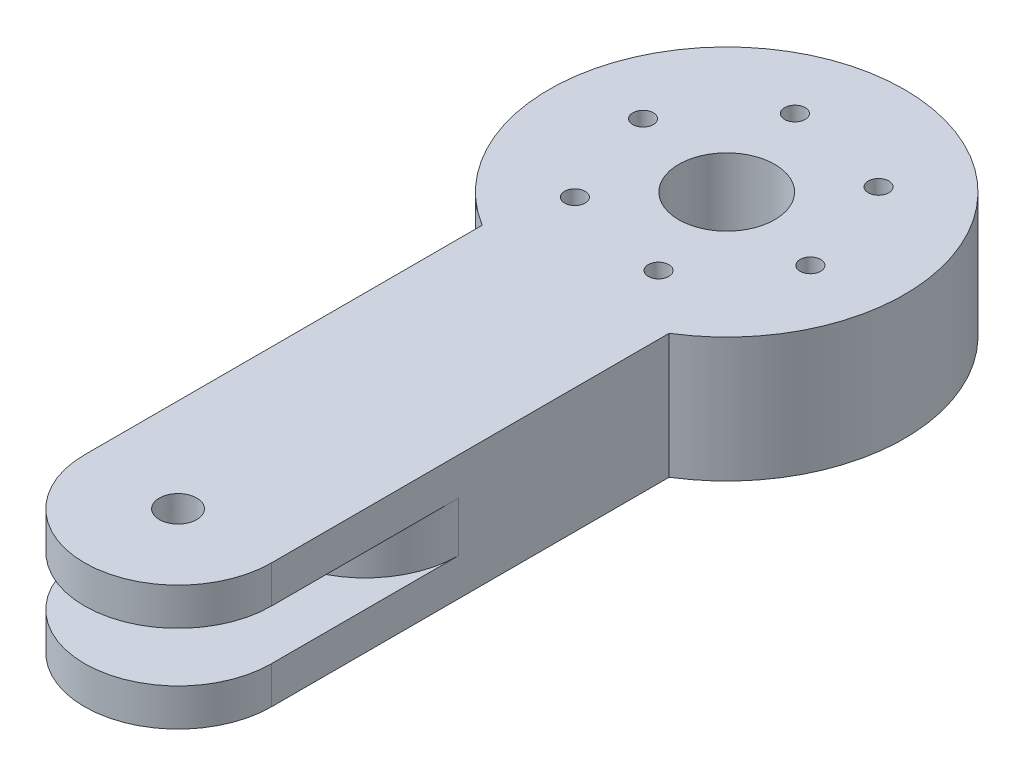
ISO-10303-21;
HEADER;
FILE_DESCRIPTION(('STEP AP214'),'2;1');
FILE_NAME('part.step','',(''),(''),'','','');
FILE_SCHEMA(('AUTOMOTIVE_DESIGN { 1 0 10303 214 1 1 1 1 }'));
ENDSEC;
DATA;
#1=APPLICATION_CONTEXT('core data for automotive mechanical design processes');
#2=APPLICATION_PROTOCOL_DEFINITION('international standard','automotive_design',2000,#1);
#3=PRODUCT_CONTEXT('',#1,'mechanical');
#4=PRODUCT('Part','Part','',(#3));
#5=PRODUCT_RELATED_PRODUCT_CATEGORY('part','',(#4));
#6=PRODUCT_DEFINITION_FORMATION('','',#4);
#7=PRODUCT_DEFINITION_CONTEXT('part definition',#1,'design');
#8=PRODUCT_DEFINITION('design','',#6,#7);
#9=PRODUCT_DEFINITION_SHAPE('','',#8);
#10=(LENGTH_UNIT() NAMED_UNIT(*) SI_UNIT(.MILLI.,.METRE.));
#11=(NAMED_UNIT(*) PLANE_ANGLE_UNIT() SI_UNIT($,.RADIAN.));
#12=(NAMED_UNIT(*) SI_UNIT($,.STERADIAN.) SOLID_ANGLE_UNIT());
#13=UNCERTAINTY_MEASURE_WITH_UNIT(LENGTH_MEASURE(1.E-05),#10,'distance_accuracy_value','');
#14=(GEOMETRIC_REPRESENTATION_CONTEXT(3) GLOBAL_UNCERTAINTY_ASSIGNED_CONTEXT((#13)) GLOBAL_UNIT_ASSIGNED_CONTEXT((#10,
#11,#12)) REPRESENTATION_CONTEXT('',''));
#15=CARTESIAN_POINT('',(0.,0.,0.));
#16=DIRECTION('',(0.,0.,1.));
#17=DIRECTION('',(1.,0.,0.));
#18=AXIS2_PLACEMENT_3D('',#15,#16,#17);
#19=CARTESIAN_POINT('',(-40.1251907915707,30.,10.8244572711556));
#20=DIRECTION('',(0.,-1.,0.));
#21=DIRECTION('',(0.,0.,-1.));
#22=AXIS2_PLACEMENT_3D('',#19,#20,#21);
#23=CYLINDRICAL_SURFACE('',#22,28.4999999999997);
#24=CARTESIAN_POINT('',(-40.1251907915707,10.,10.8244572711556));
#25=DIRECTION('',(0.,1.,0.));
#26=DIRECTION('',(0.,0.,1.));
#27=AXIS2_PLACEMENT_3D('',#24,#25,#26);
#28=CIRCLE('',#27,28.4999999999997);
#29=CARTESIAN_POINT('',(-25.1251907915707,10.,35.0576989032604));
#30=VERTEX_POINT('',#29);
#31=CARTESIAN_POINT('',(-55.1251907915709,10.,35.0576989032603));
#32=VERTEX_POINT('',#31);
#33=EDGE_CURVE('E181',#30,#32,#28,.T.);
#34=ORIENTED_EDGE('',*,*,#33,.T.);
#35=DIRECTION('',(0.,1.,0.));
#36=VECTOR('',#35,1.);
#37=CARTESIAN_POINT('',(-55.1251907915709,24.,35.0576989032603));
#38=LINE('',#37,#36);
#39=CARTESIAN_POINT('',(-55.1251907915709,30.,35.0576989032603));
#40=VERTEX_POINT('',#39);
#41=EDGE_CURVE('E60',#32,#40,#38,.T.);
#42=ORIENTED_EDGE('',*,*,#41,.T.);
#43=CARTESIAN_POINT('',(-40.1251907915707,30.,10.8244572711556));
#44=DIRECTION('',(0.,1.,0.));
#45=DIRECTION('',(0.,0.,1.));
#46=AXIS2_PLACEMENT_3D('',#43,#44,#45);
#47=CIRCLE('',#46,28.4999999999997);
#48=CARTESIAN_POINT('',(-25.1251907915709,30.,35.0576989032606));
#49=VERTEX_POINT('',#48);
#50=EDGE_CURVE('E11',#49,#40,#47,.T.);
#51=ORIENTED_EDGE('',*,*,#50,.F.);
#52=DIRECTION('',(0.,1.,0.));
#53=VECTOR('',#52,1.);
#54=CARTESIAN_POINT('',(-25.1251907915709,24.,35.0576989032606));
#55=LINE('',#54,#53);
#56=EDGE_CURVE('E67',#30,#49,#55,.T.);
#57=ORIENTED_EDGE('',*,*,#56,.F.);
#58=EDGE_LOOP('',(#34,#42,#51,#57));
#59=FACE_BOUND('',#58,.T.);
#60=ADVANCED_FACE('F43',(#59),#23,.T.);
#61=CARTESIAN_POINT('',(0.,24.,0.));
#62=DIRECTION('',(0.,1.,0.));
#63=DIRECTION('',(0.,0.,1.));
#64=AXIS2_PLACEMENT_3D('',#61,#62,#63);
#65=PLANE('',#64);
#66=CARTESIAN_POINT('',(-40.1257253954097,24.,98.8227105650031));
#67=DIRECTION('',(0.,1.,0.));
#68=DIRECTION('',(0.,0.,1.));
#69=AXIS2_PLACEMENT_3D('',#66,#67,#68);
#70=CIRCLE('',#69,3.);
#71=CARTESIAN_POINT('',(-40.1257253954097,24.,101.822710565003));
#72=VERTEX_POINT('',#71);
#73=EDGE_CURVE('E140',#72,#72,#70,.T.);
#74=ORIENTED_EDGE('',*,*,#73,.T.);
#75=EDGE_LOOP('',(#74));
#76=FACE_BOUND('',#75,.T.);
#77=CARTESIAN_POINT('',(-40.1251907915707,24.,68.824205806814));
#78=DIRECTION('',(0.,-1.,0.));
#79=DIRECTION('',(0.,0.,-1.));
#80=AXIS2_PLACEMENT_3D('',#77,#78,#79);
#81=CIRCLE('',#80,15.);
#82=CARTESIAN_POINT('',(-25.1251907915708,24.,68.8242058068139));
#83=VERTEX_POINT('',#82);
#84=CARTESIAN_POINT('',(-55.1251907915708,24.,68.8242058068141));
#85=VERTEX_POINT('',#84);
#86=EDGE_CURVE('E130',#83,#85,#81,.T.);
#87=ORIENTED_EDGE('',*,*,#86,.F.);
#88=DIRECTION('',(0.,0.,-1.));
#89=VECTOR('',#88,1.);
#90=CARTESIAN_POINT('',(-25.1251907915711,24.,0.));
#91=LINE('',#90,#89);
#92=CARTESIAN_POINT('',(-25.1251907915707,24.,98.8244572711556));
#93=VERTEX_POINT('',#92);
#94=EDGE_CURVE('E162',#93,#83,#91,.T.);
#95=ORIENTED_EDGE('',*,*,#94,.F.);
#96=CARTESIAN_POINT('',(-40.1251907915707,24.,98.8244572711556));
#97=DIRECTION('',(0.,1.,0.));
#98=DIRECTION('',(0.,0.,1.));
#99=AXIS2_PLACEMENT_3D('',#96,#97,#98);
#100=CIRCLE('',#99,15.);
#101=CARTESIAN_POINT('',(-55.1251907915707,24.,98.8244572711556));
#102=VERTEX_POINT('',#101);
#103=EDGE_CURVE('E158',#102,#93,#100,.T.);
#104=ORIENTED_EDGE('',*,*,#103,.F.);
#105=DIRECTION('',(0.,0.,-1.));
#106=VECTOR('',#105,1.);
#107=CARTESIAN_POINT('',(-55.1251907915711,24.,1.91953480528407E-13));
#108=LINE('',#107,#106);
#109=EDGE_CURVE('E156',#102,#85,#108,.T.);
#110=ORIENTED_EDGE('',*,*,#109,.T.);
#111=EDGE_LOOP('',(#87,#95,#104,#110));
#112=FACE_BOUND('',#111,.T.);
#113=ADVANCED_FACE('F230',(#76,#112),#65,.F.);
#114=CARTESIAN_POINT('',(-51.5859810452072,30.,23.7168110811525));
#115=DIRECTION('',(0.,-1.,0.));
#116=DIRECTION('',(0.,0.,-1.));
#117=AXIS2_PLACEMENT_3D('',#114,#115,#116);
#118=CYLINDRICAL_SURFACE('',#117,1.65000000000003);
#119=CARTESIAN_POINT('',(-51.5859810452072,30.,23.7168110811525));
#120=DIRECTION('',(0.,1.,0.));
#121=DIRECTION('',(0.,0.,1.));
#122=AXIS2_PLACEMENT_3D('',#119,#120,#121);
#123=CIRCLE('',#122,1.65000000000003);
#124=CARTESIAN_POINT('',(-51.5859810452072,30.,25.3668110811525));
#125=VERTEX_POINT('',#124);
#126=EDGE_CURVE('E52',#125,#125,#123,.T.);
#127=ORIENTED_EDGE('',*,*,#126,.T.);
#128=EDGE_LOOP('',(#127));
#129=FACE_BOUND('',#128,.T.);
#130=CARTESIAN_POINT('',(-51.5859810452072,10.,23.7168110811525));
#131=DIRECTION('',(0.,1.,0.));
#132=DIRECTION('',(0.,0.,1.));
#133=AXIS2_PLACEMENT_3D('',#130,#131,#132);
#134=CIRCLE('',#133,1.65000000000003);
#135=CARTESIAN_POINT('',(-51.5859810452072,10.,25.3668110811525));
#136=VERTEX_POINT('',#135);
#137=EDGE_CURVE('E215',#136,#136,#134,.T.);
#138=ORIENTED_EDGE('',*,*,#137,.F.);
#139=EDGE_LOOP('',(#138));
#140=FACE_BOUND('',#139,.T.);
#141=ADVANCED_FACE('F258',(#129,#140),#118,.F.);
#142=CARTESIAN_POINT('',(-57.0206918324232,30.,7.34529866905957));
#143=DIRECTION('',(0.,-1.,0.));
#144=DIRECTION('',(0.,0.,-1.));
#145=AXIS2_PLACEMENT_3D('',#142,#143,#144);
#146=CYLINDRICAL_SURFACE('',#145,1.64999999999999);
#147=CARTESIAN_POINT('',(-57.0206918324232,30.,7.34529866905957));
#148=DIRECTION('',(0.,1.,0.));
#149=DIRECTION('',(0.,0.,1.));
#150=AXIS2_PLACEMENT_3D('',#147,#148,#149);
#151=CIRCLE('',#150,1.64999999999999);
#152=CARTESIAN_POINT('',(-57.0206918324232,30.,8.99529866905956));
#153=VERTEX_POINT('',#152);
#154=EDGE_CURVE('E193',#153,#153,#151,.T.);
#155=ORIENTED_EDGE('',*,*,#154,.T.);
#156=EDGE_LOOP('',(#155));
#157=FACE_BOUND('',#156,.T.);
#158=CARTESIAN_POINT('',(-57.0206918324232,10.,7.34529866905957));
#159=DIRECTION('',(0.,1.,0.));
#160=DIRECTION('',(0.,0.,1.));
#161=AXIS2_PLACEMENT_3D('',#158,#159,#160);
#162=CIRCLE('',#161,1.64999999999999);
#163=CARTESIAN_POINT('',(-57.0206918324232,10.,8.99529866905956));
#164=VERTEX_POINT('',#163);
#165=EDGE_CURVE('E212',#164,#164,#162,.T.);
#166=ORIENTED_EDGE('',*,*,#165,.F.);
#167=EDGE_LOOP('',(#166));
#168=FACE_BOUND('',#167,.T.);
#169=ADVANCED_FACE('F264',(#157,#168),#146,.F.);
#170=CARTESIAN_POINT('',(-45.5599015787862,30.,-5.54705514093749));
#171=DIRECTION('',(0.,-1.,0.));
#172=DIRECTION('',(0.,0.,-1.));
#173=AXIS2_PLACEMENT_3D('',#170,#171,#172);
#174=CYLINDRICAL_SURFACE('',#173,1.64999999999985);
#175=CARTESIAN_POINT('',(-45.5599015787862,30.,-5.54705514093749));
#176=DIRECTION('',(0.,1.,0.));
#177=DIRECTION('',(0.,0.,1.));
#178=AXIS2_PLACEMENT_3D('',#175,#176,#177);
#179=CIRCLE('',#178,1.64999999999985);
#180=CARTESIAN_POINT('',(-45.5599015787862,30.,-3.89705514093763));
#181=VERTEX_POINT('',#180);
#182=EDGE_CURVE('E190',#181,#181,#179,.T.);
#183=ORIENTED_EDGE('',*,*,#182,.T.);
#184=EDGE_LOOP('',(#183));
#185=FACE_BOUND('',#184,.T.);
#186=CARTESIAN_POINT('',(-45.5599015787862,10.,-5.54705514093749));
#187=DIRECTION('',(0.,1.,0.));
#188=DIRECTION('',(0.,0.,1.));
#189=AXIS2_PLACEMENT_3D('',#186,#187,#188);
#190=CIRCLE('',#189,1.64999999999985);
#191=CARTESIAN_POINT('',(-45.5599015787862,10.,-3.89705514093763));
#192=VERTEX_POINT('',#191);
#193=EDGE_CURVE('E209',#192,#192,#190,.T.);
#194=ORIENTED_EDGE('',*,*,#193,.F.);
#195=EDGE_LOOP('',(#194));
#196=FACE_BOUND('',#195,.T.);
#197=ADVANCED_FACE('F268',(#185,#196),#174,.F.);
#198=CARTESIAN_POINT('',(-28.6644005379332,30.,-2.06789653884179));
#199=DIRECTION('',(0.,-1.,0.));
#200=DIRECTION('',(0.,0.,-1.));
#201=AXIS2_PLACEMENT_3D('',#198,#199,#200);
#202=CYLINDRICAL_SURFACE('',#201,1.64999999999985);
#203=CARTESIAN_POINT('',(-28.6644005379332,30.,-2.06789653884179));
#204=DIRECTION('',(0.,1.,0.));
#205=DIRECTION('',(0.,0.,1.));
#206=AXIS2_PLACEMENT_3D('',#203,#204,#205);
#207=CIRCLE('',#206,1.64999999999985);
#208=CARTESIAN_POINT('',(-28.6644005379332,30.,-0.417896538841942));
#209=VERTEX_POINT('',#208);
#210=EDGE_CURVE('E187',#209,#209,#207,.T.);
#211=ORIENTED_EDGE('',*,*,#210,.T.);
#212=EDGE_LOOP('',(#211));
#213=FACE_BOUND('',#212,.T.);
#214=CARTESIAN_POINT('',(-28.6644005379332,10.,-2.06789653884179));
#215=DIRECTION('',(0.,1.,0.));
#216=DIRECTION('',(0.,0.,1.));
#217=AXIS2_PLACEMENT_3D('',#214,#215,#216);
#218=CIRCLE('',#217,1.64999999999985);
#219=CARTESIAN_POINT('',(-28.6644005379332,10.,-0.417896538841942));
#220=VERTEX_POINT('',#219);
#221=EDGE_CURVE('E206',#220,#220,#218,.T.);
#222=ORIENTED_EDGE('',*,*,#221,.F.);
#223=EDGE_LOOP('',(#222));
#224=FACE_BOUND('',#223,.T.);
#225=ADVANCED_FACE('F272',(#213,#224),#202,.F.);
#226=CARTESIAN_POINT('',(-34.6904800043532,30.,27.1959696832484));
#227=DIRECTION('',(0.,-1.,0.));
#228=DIRECTION('',(0.,0.,-1.));
#229=AXIS2_PLACEMENT_3D('',#226,#227,#228);
#230=CYLINDRICAL_SURFACE('',#229,1.65000000000006);
#231=CARTESIAN_POINT('',(-34.6904800043532,30.,27.1959696832484));
#232=DIRECTION('',(0.,1.,0.));
#233=DIRECTION('',(0.,0.,1.));
#234=AXIS2_PLACEMENT_3D('',#231,#232,#233);
#235=CIRCLE('',#234,1.65000000000006);
#236=CARTESIAN_POINT('',(-34.6904800043532,30.,28.8459696832485));
#237=VERTEX_POINT('',#236);
#238=EDGE_CURVE('E184',#237,#237,#235,.T.);
#239=ORIENTED_EDGE('',*,*,#238,.T.);
#240=EDGE_LOOP('',(#239));
#241=FACE_BOUND('',#240,.T.);
#242=CARTESIAN_POINT('',(-34.6904800043532,10.,27.1959696832484));
#243=DIRECTION('',(0.,1.,0.));
#244=DIRECTION('',(0.,0.,1.));
#245=AXIS2_PLACEMENT_3D('',#242,#243,#244);
#246=CIRCLE('',#245,1.65000000000006);
#247=CARTESIAN_POINT('',(-34.6904800043532,10.,28.8459696832485));
#248=VERTEX_POINT('',#247);
#249=EDGE_CURVE('E203',#248,#248,#246,.T.);
#250=ORIENTED_EDGE('',*,*,#249,.F.);
#251=EDGE_LOOP('',(#250));
#252=FACE_BOUND('',#251,.T.);
#253=ADVANCED_FACE('F276',(#241,#252),#230,.F.);
#254=CARTESIAN_POINT('',(-23.2296897507172,30.,14.3036158732512));
#255=DIRECTION('',(0.,-1.,0.));
#256=DIRECTION('',(0.,0.,-1.));
#257=AXIS2_PLACEMENT_3D('',#254,#255,#256);
#258=CYLINDRICAL_SURFACE('',#257,1.64999999999999);
#259=CARTESIAN_POINT('',(-23.2296897507172,30.,14.3036158732512));
#260=DIRECTION('',(0.,1.,0.));
#261=DIRECTION('',(0.,0.,1.));
#262=AXIS2_PLACEMENT_3D('',#259,#260,#261);
#263=CIRCLE('',#262,1.64999999999999);
#264=CARTESIAN_POINT('',(-23.2296897507172,30.,15.9536158732512));
#265=VERTEX_POINT('',#264);
#266=EDGE_CURVE('E180',#265,#265,#263,.T.);
#267=ORIENTED_EDGE('',*,*,#266,.T.);
#268=EDGE_LOOP('',(#267));
#269=FACE_BOUND('',#268,.T.);
#270=CARTESIAN_POINT('',(-23.2296897507172,10.,14.3036158732512));
#271=DIRECTION('',(0.,1.,0.));
#272=DIRECTION('',(0.,0.,1.));
#273=AXIS2_PLACEMENT_3D('',#270,#271,#272);
#274=CIRCLE('',#273,1.64999999999999);
#275=CARTESIAN_POINT('',(-23.2296897507172,10.,15.9536158732512));
#276=VERTEX_POINT('',#275);
#277=EDGE_CURVE('E200',#276,#276,#274,.T.);
#278=ORIENTED_EDGE('',*,*,#277,.F.);
#279=EDGE_LOOP('',(#278));
#280=FACE_BOUND('',#279,.T.);
#281=ADVANCED_FACE('F247',(#269,#280),#258,.F.);
#282=CARTESIAN_POINT('',(-40.1251907915707,30.,10.8244572711556));
#283=DIRECTION('',(0.,-1.,0.));
#284=DIRECTION('',(0.,0.,-1.));
#285=AXIS2_PLACEMENT_3D('',#282,#283,#284);
#286=CYLINDRICAL_SURFACE('',#285,7.7);
#287=CARTESIAN_POINT('',(-40.1251907915707,30.,10.8244572711556));
#288=DIRECTION('',(0.,1.,0.));
#289=DIRECTION('',(0.,0.,1.));
#290=AXIS2_PLACEMENT_3D('',#287,#288,#289);
#291=CIRCLE('',#290,7.7);
#292=CARTESIAN_POINT('',(-40.1251907915707,30.,18.5244572711556));
#293=VERTEX_POINT('',#292);
#294=EDGE_CURVE('E177',#293,#293,#291,.T.);
#295=ORIENTED_EDGE('',*,*,#294,.T.);
#296=EDGE_LOOP('',(#295));
#297=FACE_BOUND('',#296,.T.);
#298=CARTESIAN_POINT('',(-40.1251907915707,10.,10.8244572711556));
#299=DIRECTION('',(0.,1.,0.));
#300=DIRECTION('',(0.,0.,1.));
#301=AXIS2_PLACEMENT_3D('',#298,#299,#300);
#302=CIRCLE('',#301,7.7);
#303=CARTESIAN_POINT('',(-40.1251907915707,10.,18.5244572711556));
#304=VERTEX_POINT('',#303);
#305=EDGE_CURVE('E172',#304,#304,#302,.T.);
#306=ORIENTED_EDGE('',*,*,#305,.F.);
#307=EDGE_LOOP('',(#306));
#308=FACE_BOUND('',#307,.T.);
#309=ADVANCED_FACE('F45',(#297,#308),#286,.F.);
#310=CARTESIAN_POINT('',(0.,30.,0.));
#311=DIRECTION('',(0.,1.,0.));
#312=DIRECTION('',(0.,0.,1.));
#313=AXIS2_PLACEMENT_3D('',#310,#311,#312);
#314=PLANE('',#313);
#315=CARTESIAN_POINT('',(-40.1257253954097,30.,98.8227105650031));
#316=DIRECTION('',(0.,-1.,0.));
#317=DIRECTION('',(0.,0.,-1.));
#318=AXIS2_PLACEMENT_3D('',#315,#316,#317);
#319=CIRCLE('',#318,3.);
#320=CARTESIAN_POINT('',(-40.1257253954097,30.,95.8227105650031));
#321=VERTEX_POINT('',#320);
#322=EDGE_CURVE('E457',#321,#321,#319,.T.);
#323=ORIENTED_EDGE('',*,*,#322,.T.);
#324=EDGE_LOOP('',(#323));
#325=FACE_BOUND('',#324,.T.);
#326=ORIENTED_EDGE('',*,*,#294,.F.);
#327=EDGE_LOOP('',(#326));
#328=FACE_BOUND('',#327,.T.);
#329=ORIENTED_EDGE('',*,*,#266,.F.);
#330=EDGE_LOOP('',(#329));
#331=FACE_BOUND('',#330,.T.);
#332=ORIENTED_EDGE('',*,*,#238,.F.);
#333=EDGE_LOOP('',(#332));
#334=FACE_BOUND('',#333,.T.);
#335=ORIENTED_EDGE('',*,*,#210,.F.);
#336=EDGE_LOOP('',(#335));
#337=FACE_BOUND('',#336,.T.);
#338=ORIENTED_EDGE('',*,*,#182,.F.);
#339=EDGE_LOOP('',(#338));
#340=FACE_BOUND('',#339,.T.);
#341=ORIENTED_EDGE('',*,*,#154,.F.);
#342=EDGE_LOOP('',(#341));
#343=FACE_BOUND('',#342,.T.);
#344=ORIENTED_EDGE('',*,*,#126,.F.);
#345=EDGE_LOOP('',(#344));
#346=FACE_BOUND('',#345,.T.);
#347=ORIENTED_EDGE('',*,*,#50,.T.);
#348=DIRECTION('',(0.,0.,-1.));
#349=VECTOR('',#348,1.);
#350=CARTESIAN_POINT('',(-55.1251907915711,30.,1.91953480528407E-13));
#351=LINE('',#350,#349);
#352=CARTESIAN_POINT('',(-55.1251907915707,30.,98.8244572711556));
#353=VERTEX_POINT('',#352);
#354=EDGE_CURVE('E155',#353,#40,#351,.T.);
#355=ORIENTED_EDGE('',*,*,#354,.F.);
#356=CARTESIAN_POINT('',(-40.1251907915707,30.,98.8244572711556));
#357=DIRECTION('',(0.,1.,0.));
#358=DIRECTION('',(0.,0.,1.));
#359=AXIS2_PLACEMENT_3D('',#356,#357,#358);
#360=CIRCLE('',#359,15.);
#361=CARTESIAN_POINT('',(-25.1251907915707,30.,98.8244572711556));
#362=VERTEX_POINT('',#361);
#363=EDGE_CURVE('E167',#353,#362,#360,.T.);
#364=ORIENTED_EDGE('',*,*,#363,.T.);
#365=DIRECTION('',(0.,0.,-1.));
#366=VECTOR('',#365,1.);
#367=CARTESIAN_POINT('',(-25.1251907915711,30.,0.));
#368=LINE('',#367,#366);
#369=EDGE_CURVE('E159',#362,#49,#368,.T.);
#370=ORIENTED_EDGE('',*,*,#369,.T.);
#371=EDGE_LOOP('',(#347,#355,#364,#370));
#372=FACE_BOUND('',#371,.T.);
#373=ADVANCED_FACE('F236',(#325,#328,#331,#334,#337,#340,#343,#346,#372),#314,.T.);
#374=CARTESIAN_POINT('',(0.,10.,0.));
#375=DIRECTION('',(0.,1.,0.));
#376=DIRECTION('',(0.,0.,1.));
#377=AXIS2_PLACEMENT_3D('',#374,#375,#376);
#378=PLANE('',#377);
#379=CARTESIAN_POINT('',(-40.1257253954097,10.,98.8227105650031));
#380=DIRECTION('',(0.,-1.,0.));
#381=DIRECTION('',(0.,0.,-1.));
#382=AXIS2_PLACEMENT_3D('',#379,#380,#381);
#383=CIRCLE('',#382,3.);
#384=CARTESIAN_POINT('',(-40.1257253954097,10.,95.8227105650031));
#385=VERTEX_POINT('',#384);
#386=EDGE_CURVE('E462',#385,#385,#383,.T.);
#387=ORIENTED_EDGE('',*,*,#386,.F.);
#388=EDGE_LOOP('',(#387));
#389=FACE_BOUND('',#388,.T.);
#390=ORIENTED_EDGE('',*,*,#305,.T.);
#391=EDGE_LOOP('',(#390));
#392=FACE_BOUND('',#391,.T.);
#393=ORIENTED_EDGE('',*,*,#277,.T.);
#394=EDGE_LOOP('',(#393));
#395=FACE_BOUND('',#394,.T.);
#396=ORIENTED_EDGE('',*,*,#249,.T.);
#397=EDGE_LOOP('',(#396));
#398=FACE_BOUND('',#397,.T.);
#399=ORIENTED_EDGE('',*,*,#221,.T.);
#400=EDGE_LOOP('',(#399));
#401=FACE_BOUND('',#400,.T.);
#402=ORIENTED_EDGE('',*,*,#193,.T.);
#403=EDGE_LOOP('',(#402));
#404=FACE_BOUND('',#403,.T.);
#405=ORIENTED_EDGE('',*,*,#165,.T.);
#406=EDGE_LOOP('',(#405));
#407=FACE_BOUND('',#406,.T.);
#408=ORIENTED_EDGE('',*,*,#137,.T.);
#409=EDGE_LOOP('',(#408));
#410=FACE_BOUND('',#409,.T.);
#411=ORIENTED_EDGE('',*,*,#33,.F.);
#412=DIRECTION('',(0.,0.,1.));
#413=VECTOR('',#412,1.);
#414=CARTESIAN_POINT('',(-25.1251907915707,10.,0.));
#415=LINE('',#414,#413);
#416=CARTESIAN_POINT('',(-25.1251907915707,10.,98.8244572711557));
#417=VERTEX_POINT('',#416);
#418=EDGE_CURVE('E117',#30,#417,#415,.T.);
#419=ORIENTED_EDGE('',*,*,#418,.T.);
#420=CARTESIAN_POINT('',(-40.1251907915708,10.,98.8244572711557));
#421=DIRECTION('',(0.,-1.,0.));
#422=DIRECTION('',(0.,0.,-1.));
#423=AXIS2_PLACEMENT_3D('',#420,#421,#422);
#424=CIRCLE('',#423,15.0000000000001);
#425=CARTESIAN_POINT('',(-55.1251907915709,10.,98.8244572711557));
#426=VERTEX_POINT('',#425);
#427=EDGE_CURVE('E112',#417,#426,#424,.T.);
#428=ORIENTED_EDGE('',*,*,#427,.T.);
#429=DIRECTION('',(0.,0.,1.));
#430=VECTOR('',#429,1.);
#431=CARTESIAN_POINT('',(-55.1251907915709,10.,0.));
#432=LINE('',#431,#430);
#433=EDGE_CURVE('E115',#32,#426,#432,.T.);
#434=ORIENTED_EDGE('',*,*,#433,.F.);
#435=EDGE_LOOP('',(#411,#419,#428,#434));
#436=FACE_BOUND('',#435,.T.);
#437=ADVANCED_FACE('F114',(#389,#392,#395,#398,#401,#404,#407,#410,#436),#378,.F.);
#438=CARTESIAN_POINT('',(-55.1251907915711,24.,1.91953480528407E-13));
#439=DIRECTION('',(1.,0.,0.));
#440=DIRECTION('',(0.,0.,-1.));
#441=AXIS2_PLACEMENT_3D('',#438,#439,#440);
#442=PLANE('',#441);
#443=ORIENTED_EDGE('',*,*,#354,.T.);
#444=ORIENTED_EDGE('',*,*,#41,.F.);
#445=ORIENTED_EDGE('',*,*,#433,.T.);
#446=DIRECTION('',(0.,1.,0.));
#447=VECTOR('',#446,1.);
#448=CARTESIAN_POINT('',(-55.1251907915709,10.,98.8244572711557));
#449=LINE('',#448,#447);
#450=CARTESIAN_POINT('',(-55.1251907915709,16.,98.8244572711557));
#451=VERTEX_POINT('',#450);
#452=EDGE_CURVE('E125',#426,#451,#449,.T.);
#453=ORIENTED_EDGE('',*,*,#452,.T.);
#454=DIRECTION('',(0.,0.,1.));
#455=VECTOR('',#454,1.);
#456=CARTESIAN_POINT('',(-55.1251907915709,16.,0.));
#457=LINE('',#456,#455);
#458=CARTESIAN_POINT('',(-55.1251907915708,16.,68.8242058068141));
#459=VERTEX_POINT('',#458);
#460=EDGE_CURVE('E139',#459,#451,#457,.T.);
#461=ORIENTED_EDGE('',*,*,#460,.F.);
#462=DIRECTION('',(0.,1.,0.));
#463=VECTOR('',#462,1.);
#464=CARTESIAN_POINT('',(-55.1251907915708,16.,68.8242058068141));
#465=LINE('',#464,#463);
#466=EDGE_CURVE('E147',#459,#85,#465,.T.);
#467=ORIENTED_EDGE('',*,*,#466,.T.);
#468=ORIENTED_EDGE('',*,*,#109,.F.);
#469=DIRECTION('',(0.,1.,0.));
#470=VECTOR('',#469,1.);
#471=CARTESIAN_POINT('',(-55.1251907915707,24.,98.8244572711556));
#472=LINE('',#471,#470);
#473=EDGE_CURVE('E165',#102,#353,#472,.T.);
#474=ORIENTED_EDGE('',*,*,#473,.T.);
#475=EDGE_LOOP('',(#443,#444,#445,#453,#461,#467,#468,#474));
#476=FACE_BOUND('',#475,.T.);
#477=ADVANCED_FACE('F133',(#476),#442,.F.);
#478=CARTESIAN_POINT('',(-25.1251907915711,24.,0.));
#479=DIRECTION('',(1.,0.,0.));
#480=DIRECTION('',(0.,0.,-1.));
#481=AXIS2_PLACEMENT_3D('',#478,#479,#480);
#482=PLANE('',#481);
#483=ORIENTED_EDGE('',*,*,#369,.F.);
#484=DIRECTION('',(0.,1.,0.));
#485=VECTOR('',#484,1.);
#486=CARTESIAN_POINT('',(-25.1251907915707,24.,98.8244572711556));
#487=LINE('',#486,#485);
#488=EDGE_CURVE('E174',#93,#362,#487,.T.);
#489=ORIENTED_EDGE('',*,*,#488,.F.);
#490=ORIENTED_EDGE('',*,*,#94,.T.);
#491=DIRECTION('',(0.,1.,0.));
#492=VECTOR('',#491,1.);
#493=CARTESIAN_POINT('',(-25.1251907915708,16.,68.8242058068139));
#494=LINE('',#493,#492);
#495=CARTESIAN_POINT('',(-25.1251907915707,16.,68.8242058068139));
#496=VERTEX_POINT('',#495);
#497=EDGE_CURVE('E152',#496,#83,#494,.T.);
#498=ORIENTED_EDGE('',*,*,#497,.F.);
#499=DIRECTION('',(0.,0.,1.));
#500=VECTOR('',#499,1.);
#501=CARTESIAN_POINT('',(-25.1251907915707,16.,0.));
#502=LINE('',#501,#500);
#503=CARTESIAN_POINT('',(-25.1251907915707,16.,98.8244572711557));
#504=VERTEX_POINT('',#503);
#505=EDGE_CURVE('E121',#496,#504,#502,.T.);
#506=ORIENTED_EDGE('',*,*,#505,.T.);
#507=DIRECTION('',(0.,1.,0.));
#508=VECTOR('',#507,1.);
#509=CARTESIAN_POINT('',(-25.1251907915707,10.,98.8244572711557));
#510=LINE('',#509,#508);
#511=EDGE_CURVE('E131',#417,#504,#510,.T.);
#512=ORIENTED_EDGE('',*,*,#511,.F.);
#513=ORIENTED_EDGE('',*,*,#418,.F.);
#514=ORIENTED_EDGE('',*,*,#56,.T.);
#515=EDGE_LOOP('',(#483,#489,#490,#498,#506,#512,#513,#514));
#516=FACE_BOUND('',#515,.T.);
#517=ADVANCED_FACE('F219',(#516),#482,.T.);
#518=CARTESIAN_POINT('',(-40.1251907915707,24.,98.8244572711556));
#519=DIRECTION('',(0.,1.,0.));
#520=DIRECTION('',(0.,0.,1.));
#521=AXIS2_PLACEMENT_3D('',#518,#519,#520);
#522=CYLINDRICAL_SURFACE('',#521,15.);
#523=ORIENTED_EDGE('',*,*,#363,.F.);
#524=ORIENTED_EDGE('',*,*,#473,.F.);
#525=ORIENTED_EDGE('',*,*,#103,.T.);
#526=ORIENTED_EDGE('',*,*,#488,.T.);
#527=EDGE_LOOP('',(#523,#524,#525,#526));
#528=FACE_BOUND('',#527,.T.);
#529=ADVANCED_FACE('F233',(#528),#522,.T.);
#530=CARTESIAN_POINT('',(-40.1251907915707,16.,68.824205806814));
#531=DIRECTION('',(0.,1.,0.));
#532=DIRECTION('',(0.,0.,1.));
#533=AXIS2_PLACEMENT_3D('',#530,#531,#532);
#534=CYLINDRICAL_SURFACE('',#533,15.);
#535=ORIENTED_EDGE('',*,*,#86,.T.);
#536=ORIENTED_EDGE('',*,*,#466,.F.);
#537=CARTESIAN_POINT('',(-40.1251907915707,16.,68.824205806814));
#538=DIRECTION('',(0.,-1.,0.));
#539=DIRECTION('',(0.,0.,-1.));
#540=AXIS2_PLACEMENT_3D('',#537,#538,#539);
#541=CIRCLE('',#540,15.);
#542=EDGE_CURVE('E144',#496,#459,#541,.T.);
#543=ORIENTED_EDGE('',*,*,#542,.F.);
#544=ORIENTED_EDGE('',*,*,#497,.T.);
#545=EDGE_LOOP('',(#535,#536,#543,#544));
#546=FACE_BOUND('',#545,.T.);
#547=ADVANCED_FACE('F227',(#546),#534,.T.);
#548=CARTESIAN_POINT('',(-40.1251907915708,10.,98.8244572711557));
#549=DIRECTION('',(0.,1.,0.));
#550=DIRECTION('',(0.,0.,1.));
#551=AXIS2_PLACEMENT_3D('',#548,#549,#550);
#552=CYLINDRICAL_SURFACE('',#551,15.0000000000001);
#553=CARTESIAN_POINT('',(-40.1251907915708,16.,98.8244572711557));
#554=DIRECTION('',(0.,-1.,0.));
#555=DIRECTION('',(0.,0.,-1.));
#556=AXIS2_PLACEMENT_3D('',#553,#554,#555);
#557=CIRCLE('',#556,15.0000000000001);
#558=EDGE_CURVE('E128',#504,#451,#557,.T.);
#559=ORIENTED_EDGE('',*,*,#558,.T.);
#560=ORIENTED_EDGE('',*,*,#452,.F.);
#561=ORIENTED_EDGE('',*,*,#427,.F.);
#562=ORIENTED_EDGE('',*,*,#511,.T.);
#563=EDGE_LOOP('',(#559,#560,#561,#562));
#564=FACE_BOUND('',#563,.T.);
#565=ADVANCED_FACE('F126',(#564),#552,.T.);
#566=CARTESIAN_POINT('',(0.,16.,0.));
#567=DIRECTION('',(0.,-1.,0.));
#568=DIRECTION('',(0.,0.,-1.));
#569=AXIS2_PLACEMENT_3D('',#566,#567,#568);
#570=PLANE('',#569);
#571=CARTESIAN_POINT('',(-40.1257253954097,16.,98.8227105650031));
#572=DIRECTION('',(0.,-1.,0.));
#573=DIRECTION('',(0.,0.,-1.));
#574=AXIS2_PLACEMENT_3D('',#571,#572,#573);
#575=CIRCLE('',#574,3.);
#576=CARTESIAN_POINT('',(-40.1257253954097,16.,95.8227105650031));
#577=VERTEX_POINT('',#576);
#578=EDGE_CURVE('E47',#577,#577,#575,.T.);
#579=ORIENTED_EDGE('',*,*,#578,.T.);
#580=EDGE_LOOP('',(#579));
#581=FACE_BOUND('',#580,.T.);
#582=ORIENTED_EDGE('',*,*,#505,.F.);
#583=ORIENTED_EDGE('',*,*,#542,.T.);
#584=ORIENTED_EDGE('',*,*,#460,.T.);
#585=ORIENTED_EDGE('',*,*,#558,.F.);
#586=EDGE_LOOP('',(#582,#583,#584,#585));
#587=FACE_BOUND('',#586,.T.);
#588=ADVANCED_FACE('F222',(#581,#587),#570,.F.);
#589=CARTESIAN_POINT('',(-40.1257253954097,30.,98.8227105650031));
#590=DIRECTION('',(0.,-1.,0.));
#591=DIRECTION('',(0.,0.,-1.));
#592=AXIS2_PLACEMENT_3D('',#589,#590,#591);
#593=CYLINDRICAL_SURFACE('',#592,3.);
#594=ORIENTED_EDGE('',*,*,#386,.T.);
#595=EDGE_LOOP('',(#594));
#596=FACE_BOUND('',#595,.T.);
#597=ORIENTED_EDGE('',*,*,#578,.F.);
#598=EDGE_LOOP('',(#597));
#599=FACE_BOUND('',#598,.T.);
#600=ADVANCED_FACE('F412',(#596,#599),#593,.F.);
#601=ORIENTED_EDGE('',*,*,#322,.F.);
#602=EDGE_LOOP('',(#601));
#603=FACE_BOUND('',#602,.T.);
#604=ORIENTED_EDGE('',*,*,#73,.F.);
#605=EDGE_LOOP('',(#604));
#606=FACE_BOUND('',#605,.T.);
#607=ADVANCED_FACE('F421',(#603,#606),#593,.F.);
#608=CLOSED_SHELL('',(#60,#113,#141,#169,#197,#225,#253,#281,#309,#373,#437,#477,#517,#529,#547,
#565,#588,#600,#607));
#609=MANIFOLD_SOLID_BREP('B2',#608);
#610=ADVANCED_BREP_SHAPE_REPRESENTATION('',(#18,#609),#14);
#611=SHAPE_DEFINITION_REPRESENTATION(#9,#610);
ENDSEC;
END-ISO-10303-21;
